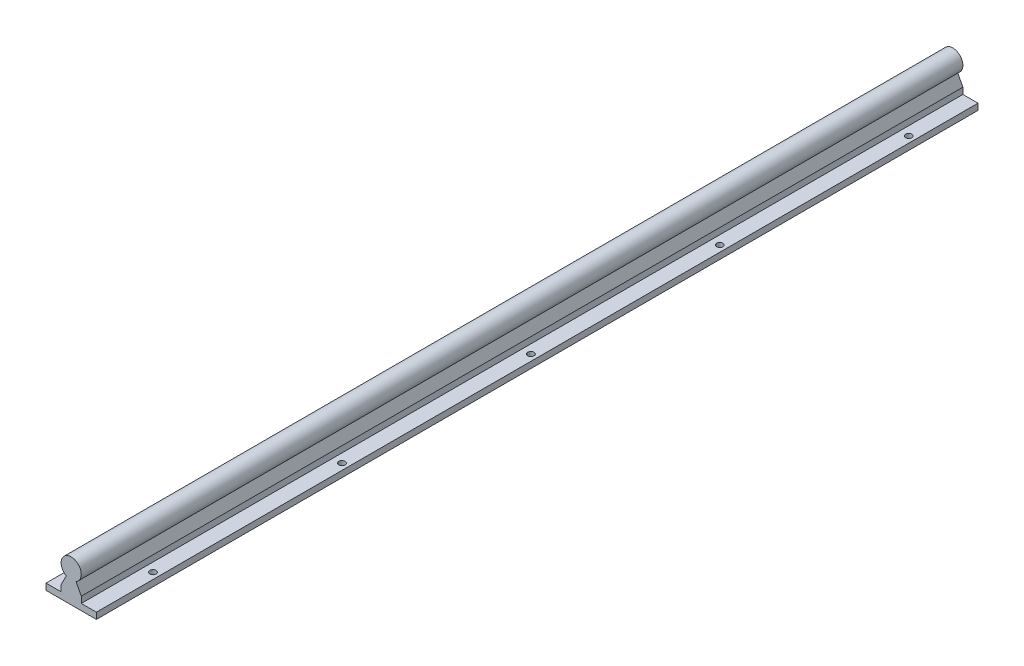
ISO-10303-21;
HEADER;
FILE_DESCRIPTION(('STEP AP214'),'2;1');
FILE_NAME('part.step','',(''),(''),'','','');
FILE_SCHEMA(('AUTOMOTIVE_DESIGN { 1 0 10303 214 1 1 1 1 }'));
ENDSEC;
DATA;
#1=APPLICATION_CONTEXT('core data for automotive mechanical design processes');
#2=APPLICATION_PROTOCOL_DEFINITION('international standard','automotive_design',2000,#1);
#3=PRODUCT_CONTEXT('',#1,'mechanical');
#4=PRODUCT('Part','Part','',(#3));
#5=PRODUCT_RELATED_PRODUCT_CATEGORY('part','',(#4));
#6=PRODUCT_DEFINITION_FORMATION('','',#4);
#7=PRODUCT_DEFINITION_CONTEXT('part definition',#1,'design');
#8=PRODUCT_DEFINITION('design','',#6,#7);
#9=PRODUCT_DEFINITION_SHAPE('','',#8);
#10=(LENGTH_UNIT() NAMED_UNIT(*) SI_UNIT(.MILLI.,.METRE.));
#11=(NAMED_UNIT(*) PLANE_ANGLE_UNIT() SI_UNIT($,.RADIAN.));
#12=(NAMED_UNIT(*) SI_UNIT($,.STERADIAN.) SOLID_ANGLE_UNIT());
#13=UNCERTAINTY_MEASURE_WITH_UNIT(LENGTH_MEASURE(1.E-05),#10,'distance_accuracy_value','');
#14=(GEOMETRIC_REPRESENTATION_CONTEXT(3) GLOBAL_UNCERTAINTY_ASSIGNED_CONTEXT((#13)) GLOBAL_UNIT_ASSIGNED_CONTEXT((#10,
#11,#12)) REPRESENTATION_CONTEXT('',''));
#15=CARTESIAN_POINT('',(0.,0.,0.));
#16=DIRECTION('',(0.,0.,1.));
#17=DIRECTION('',(1.,0.,0.));
#18=AXIS2_PLACEMENT_3D('',#15,#16,#17);
#19=CARTESIAN_POINT('',(-10.3929134539516,5.36146586323541,700.));
#20=DIRECTION('',(-0.88871189671419,0.458466099770382,0.));
#21=DIRECTION('',(-0.458466099770382,-0.888711896714191,0.));
#22=AXIS2_PLACEMENT_3D('',#19,#20,#21);
#23=PLANE('',#22);
#24=DIRECTION('',(0.458466099770382,0.888711896714191,0.));
#25=VECTOR('',#24,1.);
#26=CARTESIAN_POINT('',(-10.3929134539516,5.36146586323541,0.));
#27=LINE('',#26,#25);
#28=CARTESIAN_POINT('',(-8.,10.,0.));
#29=VERTEX_POINT('',#28);
#30=CARTESIAN_POINT('',(-3.87298334620742,18.,0.));
#31=VERTEX_POINT('',#30);
#32=EDGE_CURVE('E145',#29,#31,#27,.T.);
#33=ORIENTED_EDGE('',*,*,#32,.F.);
#34=DIRECTION('',(0.,0.,-1.));
#35=VECTOR('',#34,1.);
#36=CARTESIAN_POINT('',(-8.,10.,700.));
#37=LINE('',#36,#35);
#38=CARTESIAN_POINT('',(-8.,10.,700.));
#39=VERTEX_POINT('',#38);
#40=EDGE_CURVE('E42',#39,#29,#37,.T.);
#41=ORIENTED_EDGE('',*,*,#40,.F.);
#42=DIRECTION('',(0.458466099770382,0.888711896714191,0.));
#43=VECTOR('',#42,1.);
#44=CARTESIAN_POINT('',(-10.3929134539516,5.36146586323541,700.));
#45=LINE('',#44,#43);
#46=CARTESIAN_POINT('',(-3.87298334620742,18.,700.));
#47=VERTEX_POINT('',#46);
#48=EDGE_CURVE('E166',#39,#47,#45,.T.);
#49=ORIENTED_EDGE('',*,*,#48,.T.);
#50=DIRECTION('',(0.,0.,-1.));
#51=VECTOR('',#50,1.);
#52=CARTESIAN_POINT('',(-3.87298334620742,18.,700.));
#53=LINE('',#52,#51);
#54=EDGE_CURVE('E11',#47,#31,#53,.T.);
#55=ORIENTED_EDGE('',*,*,#54,.T.);
#56=EDGE_LOOP('',(#33,#41,#49,#55));
#57=FACE_BOUND('',#56,.T.);
#58=ADVANCED_FACE('F34',(#57),#23,.T.);
#59=CARTESIAN_POINT('',(-8.,0.,700.));
#60=DIRECTION('',(-1.,0.,0.));
#61=DIRECTION('',(0.,0.,1.));
#62=AXIS2_PLACEMENT_3D('',#59,#60,#61);
#63=PLANE('',#62);
#64=DIRECTION('',(0.,1.,0.));
#65=VECTOR('',#64,1.);
#66=CARTESIAN_POINT('',(-8.,0.,0.));
#67=LINE('',#66,#65);
#68=CARTESIAN_POINT('',(-8.,5.,0.));
#69=VERTEX_POINT('',#68);
#70=EDGE_CURVE('E147',#69,#29,#67,.T.);
#71=ORIENTED_EDGE('',*,*,#70,.F.);
#72=DIRECTION('',(0.,0.,-1.));
#73=VECTOR('',#72,1.);
#74=CARTESIAN_POINT('',(-8.,5.,700.));
#75=LINE('',#74,#73);
#76=CARTESIAN_POINT('',(-8.,5.,700.));
#77=VERTEX_POINT('',#76);
#78=EDGE_CURVE('E176',#77,#69,#75,.T.);
#79=ORIENTED_EDGE('',*,*,#78,.F.);
#80=DIRECTION('',(0.,1.,0.));
#81=VECTOR('',#80,1.);
#82=CARTESIAN_POINT('',(-8.,0.,700.));
#83=LINE('',#82,#81);
#84=EDGE_CURVE('E182',#77,#39,#83,.T.);
#85=ORIENTED_EDGE('',*,*,#84,.T.);
#86=ORIENTED_EDGE('',*,*,#40,.T.);
#87=EDGE_LOOP('',(#71,#79,#85,#86));
#88=FACE_BOUND('',#87,.T.);
#89=ADVANCED_FACE('F180',(#88),#63,.T.);
#90=CARTESIAN_POINT('',(0.,5.,700.));
#91=DIRECTION('',(0.,1.,0.));
#92=DIRECTION('',(0.,0.,1.));
#93=AXIS2_PLACEMENT_3D('',#90,#91,#92);
#94=PLANE('',#93);
#95=CARTESIAN_POINT('',(-15.,5.,49.9999999999999));
#96=DIRECTION('',(0.,1.,0.));
#97=DIRECTION('',(0.,0.,1.));
#98=AXIS2_PLACEMENT_3D('',#95,#96,#97);
#99=CIRCLE('',#98,2.49999999999999);
#100=CARTESIAN_POINT('',(-15.,5.,52.4999999999999));
#101=VERTEX_POINT('',#100);
#102=EDGE_CURVE('E269',#101,#101,#99,.T.);
#103=ORIENTED_EDGE('',*,*,#102,.F.);
#104=EDGE_LOOP('',(#103));
#105=FACE_BOUND('',#104,.T.);
#106=CARTESIAN_POINT('',(-15.,5.,200.));
#107=DIRECTION('',(0.,1.,0.));
#108=DIRECTION('',(0.,0.,1.));
#109=AXIS2_PLACEMENT_3D('',#106,#107,#108);
#110=CIRCLE('',#109,2.49999999999999);
#111=CARTESIAN_POINT('',(-15.,5.,202.5));
#112=VERTEX_POINT('',#111);
#113=EDGE_CURVE('E257',#112,#112,#110,.T.);
#114=ORIENTED_EDGE('',*,*,#113,.F.);
#115=EDGE_LOOP('',(#114));
#116=FACE_BOUND('',#115,.T.);
#117=CARTESIAN_POINT('',(-15.,5.,350.));
#118=DIRECTION('',(0.,1.,0.));
#119=DIRECTION('',(0.,0.,1.));
#120=AXIS2_PLACEMENT_3D('',#117,#118,#119);
#121=CIRCLE('',#120,2.49999999999999);
#122=CARTESIAN_POINT('',(-15.,5.,352.5));
#123=VERTEX_POINT('',#122);
#124=EDGE_CURVE('E245',#123,#123,#121,.T.);
#125=ORIENTED_EDGE('',*,*,#124,.F.);
#126=EDGE_LOOP('',(#125));
#127=FACE_BOUND('',#126,.T.);
#128=CARTESIAN_POINT('',(-15.,5.,500.));
#129=DIRECTION('',(0.,1.,0.));
#130=DIRECTION('',(0.,0.,1.));
#131=AXIS2_PLACEMENT_3D('',#128,#129,#130);
#132=CIRCLE('',#131,2.49999999999999);
#133=CARTESIAN_POINT('',(-15.,5.,502.5));
#134=VERTEX_POINT('',#133);
#135=EDGE_CURVE('E233',#134,#134,#132,.T.);
#136=ORIENTED_EDGE('',*,*,#135,.F.);
#137=EDGE_LOOP('',(#136));
#138=FACE_BOUND('',#137,.T.);
#139=CARTESIAN_POINT('',(-15.,5.,650.));
#140=DIRECTION('',(0.,1.,0.));
#141=DIRECTION('',(0.,0.,1.));
#142=AXIS2_PLACEMENT_3D('',#139,#140,#141);
#143=CIRCLE('',#142,2.49999999999999);
#144=CARTESIAN_POINT('',(-15.,5.,652.5));
#145=VERTEX_POINT('',#144);
#146=EDGE_CURVE('E219',#145,#145,#143,.T.);
#147=ORIENTED_EDGE('',*,*,#146,.F.);
#148=EDGE_LOOP('',(#147));
#149=FACE_BOUND('',#148,.T.);
#150=DIRECTION('',(1.,0.,0.));
#151=VECTOR('',#150,1.);
#152=CARTESIAN_POINT('',(0.,5.,0.));
#153=LINE('',#152,#151);
#154=CARTESIAN_POINT('',(-20.,5.,0.));
#155=VERTEX_POINT('',#154);
#156=EDGE_CURVE('E151',#155,#69,#153,.T.);
#157=ORIENTED_EDGE('',*,*,#156,.F.);
#158=DIRECTION('',(0.,0.,-1.));
#159=VECTOR('',#158,1.);
#160=CARTESIAN_POINT('',(-20.,5.,700.));
#161=LINE('',#160,#159);
#162=CARTESIAN_POINT('',(-20.,5.,700.));
#163=VERTEX_POINT('',#162);
#164=EDGE_CURVE('E174',#163,#155,#161,.T.);
#165=ORIENTED_EDGE('',*,*,#164,.F.);
#166=DIRECTION('',(1.,0.,0.));
#167=VECTOR('',#166,1.);
#168=CARTESIAN_POINT('',(0.,5.,700.));
#169=LINE('',#168,#167);
#170=EDGE_CURVE('E192',#163,#77,#169,.T.);
#171=ORIENTED_EDGE('',*,*,#170,.T.);
#172=ORIENTED_EDGE('',*,*,#78,.T.);
#173=EDGE_LOOP('',(#157,#165,#171,#172));
#174=FACE_BOUND('',#173,.T.);
#175=ADVANCED_FACE('F189',(#105,#116,#127,#138,#149,#174),#94,.T.);
#176=CARTESIAN_POINT('',(-20.,0.,700.));
#177=DIRECTION('',(-1.,0.,0.));
#178=DIRECTION('',(0.,0.,1.));
#179=AXIS2_PLACEMENT_3D('',#176,#177,#178);
#180=PLANE('',#179);
#181=DIRECTION('',(0.,1.,0.));
#182=VECTOR('',#181,1.);
#183=CARTESIAN_POINT('',(-20.,0.,0.));
#184=LINE('',#183,#182);
#185=CARTESIAN_POINT('',(-20.,0.,0.));
#186=VERTEX_POINT('',#185);
#187=EDGE_CURVE('E154',#186,#155,#184,.T.);
#188=ORIENTED_EDGE('',*,*,#187,.F.);
#189=DIRECTION('',(0.,0.,-1.));
#190=VECTOR('',#189,1.);
#191=CARTESIAN_POINT('',(-20.,0.,700.));
#192=LINE('',#191,#190);
#193=CARTESIAN_POINT('',(-20.,0.,700.));
#194=VERTEX_POINT('',#193);
#195=EDGE_CURVE('E172',#194,#186,#192,.T.);
#196=ORIENTED_EDGE('',*,*,#195,.F.);
#197=DIRECTION('',(0.,1.,0.));
#198=VECTOR('',#197,1.);
#199=CARTESIAN_POINT('',(-20.,0.,700.));
#200=LINE('',#199,#198);
#201=EDGE_CURVE('E196',#194,#163,#200,.T.);
#202=ORIENTED_EDGE('',*,*,#201,.T.);
#203=ORIENTED_EDGE('',*,*,#164,.T.);
#204=EDGE_LOOP('',(#188,#196,#202,#203));
#205=FACE_BOUND('',#204,.T.);
#206=ADVANCED_FACE('F202',(#205),#180,.T.);
#207=CARTESIAN_POINT('',(0.,0.,700.));
#208=DIRECTION('',(0.,1.,0.));
#209=DIRECTION('',(0.,0.,1.));
#210=AXIS2_PLACEMENT_3D('',#207,#208,#209);
#211=PLANE('',#210);
#212=CARTESIAN_POINT('',(15.,0.,49.9999999999999));
#213=DIRECTION('',(0.,1.,0.));
#214=DIRECTION('',(0.,0.,1.));
#215=AXIS2_PLACEMENT_3D('',#212,#213,#214);
#216=CIRCLE('',#215,2.49999999999999);
#217=CARTESIAN_POINT('',(15.,0.,52.4999999999999));
#218=VERTEX_POINT('',#217);
#219=EDGE_CURVE('E272',#218,#218,#216,.T.);
#220=ORIENTED_EDGE('',*,*,#219,.T.);
#221=EDGE_LOOP('',(#220));
#222=FACE_BOUND('',#221,.T.);
#223=CARTESIAN_POINT('',(-15.,0.,49.9999999999999));
#224=DIRECTION('',(0.,1.,0.));
#225=DIRECTION('',(0.,0.,1.));
#226=AXIS2_PLACEMENT_3D('',#223,#224,#225);
#227=CIRCLE('',#226,2.49999999999999);
#228=CARTESIAN_POINT('',(-15.,0.,52.4999999999999));
#229=VERTEX_POINT('',#228);
#230=EDGE_CURVE('E266',#229,#229,#227,.T.);
#231=ORIENTED_EDGE('',*,*,#230,.T.);
#232=EDGE_LOOP('',(#231));
#233=FACE_BOUND('',#232,.T.);
#234=CARTESIAN_POINT('',(15.,0.,200.));
#235=DIRECTION('',(0.,1.,0.));
#236=DIRECTION('',(0.,0.,1.));
#237=AXIS2_PLACEMENT_3D('',#234,#235,#236);
#238=CIRCLE('',#237,2.49999999999999);
#239=CARTESIAN_POINT('',(15.,0.,202.5));
#240=VERTEX_POINT('',#239);
#241=EDGE_CURVE('E260',#240,#240,#238,.T.);
#242=ORIENTED_EDGE('',*,*,#241,.T.);
#243=EDGE_LOOP('',(#242));
#244=FACE_BOUND('',#243,.T.);
#245=CARTESIAN_POINT('',(-15.,0.,200.));
#246=DIRECTION('',(0.,1.,0.));
#247=DIRECTION('',(0.,0.,1.));
#248=AXIS2_PLACEMENT_3D('',#245,#246,#247);
#249=CIRCLE('',#248,2.49999999999999);
#250=CARTESIAN_POINT('',(-15.,0.,202.5));
#251=VERTEX_POINT('',#250);
#252=EDGE_CURVE('E254',#251,#251,#249,.T.);
#253=ORIENTED_EDGE('',*,*,#252,.T.);
#254=EDGE_LOOP('',(#253));
#255=FACE_BOUND('',#254,.T.);
#256=CARTESIAN_POINT('',(15.,0.,350.));
#257=DIRECTION('',(0.,1.,0.));
#258=DIRECTION('',(0.,0.,1.));
#259=AXIS2_PLACEMENT_3D('',#256,#257,#258);
#260=CIRCLE('',#259,2.49999999999999);
#261=CARTESIAN_POINT('',(15.,0.,352.5));
#262=VERTEX_POINT('',#261);
#263=EDGE_CURVE('E248',#262,#262,#260,.T.);
#264=ORIENTED_EDGE('',*,*,#263,.T.);
#265=EDGE_LOOP('',(#264));
#266=FACE_BOUND('',#265,.T.);
#267=CARTESIAN_POINT('',(-15.,0.,350.));
#268=DIRECTION('',(0.,1.,0.));
#269=DIRECTION('',(0.,0.,1.));
#270=AXIS2_PLACEMENT_3D('',#267,#268,#269);
#271=CIRCLE('',#270,2.49999999999999);
#272=CARTESIAN_POINT('',(-15.,0.,352.5));
#273=VERTEX_POINT('',#272);
#274=EDGE_CURVE('E242',#273,#273,#271,.T.);
#275=ORIENTED_EDGE('',*,*,#274,.T.);
#276=EDGE_LOOP('',(#275));
#277=FACE_BOUND('',#276,.T.);
#278=CARTESIAN_POINT('',(15.,0.,500.));
#279=DIRECTION('',(0.,1.,0.));
#280=DIRECTION('',(0.,0.,1.));
#281=AXIS2_PLACEMENT_3D('',#278,#279,#280);
#282=CIRCLE('',#281,2.49999999999999);
#283=CARTESIAN_POINT('',(15.,0.,502.5));
#284=VERTEX_POINT('',#283);
#285=EDGE_CURVE('E236',#284,#284,#282,.T.);
#286=ORIENTED_EDGE('',*,*,#285,.T.);
#287=EDGE_LOOP('',(#286));
#288=FACE_BOUND('',#287,.T.);
#289=CARTESIAN_POINT('',(-15.,0.,500.));
#290=DIRECTION('',(0.,1.,0.));
#291=DIRECTION('',(0.,0.,1.));
#292=AXIS2_PLACEMENT_3D('',#289,#290,#291);
#293=CIRCLE('',#292,2.49999999999999);
#294=CARTESIAN_POINT('',(-15.,0.,502.5));
#295=VERTEX_POINT('',#294);
#296=EDGE_CURVE('E230',#295,#295,#293,.T.);
#297=ORIENTED_EDGE('',*,*,#296,.T.);
#298=EDGE_LOOP('',(#297));
#299=FACE_BOUND('',#298,.T.);
#300=CARTESIAN_POINT('',(15.,0.,650.));
#301=DIRECTION('',(0.,1.,0.));
#302=DIRECTION('',(0.,0.,1.));
#303=AXIS2_PLACEMENT_3D('',#300,#301,#302);
#304=CIRCLE('',#303,2.49999999999999);
#305=CARTESIAN_POINT('',(15.,0.,652.5));
#306=VERTEX_POINT('',#305);
#307=EDGE_CURVE('E224',#306,#306,#304,.T.);
#308=ORIENTED_EDGE('',*,*,#307,.T.);
#309=EDGE_LOOP('',(#308));
#310=FACE_BOUND('',#309,.T.);
#311=CARTESIAN_POINT('',(-15.,0.,650.));
#312=DIRECTION('',(0.,1.,0.));
#313=DIRECTION('',(0.,0.,1.));
#314=AXIS2_PLACEMENT_3D('',#311,#312,#313);
#315=CIRCLE('',#314,2.49999999999999);
#316=CARTESIAN_POINT('',(-15.,0.,652.5));
#317=VERTEX_POINT('',#316);
#318=EDGE_CURVE('E216',#317,#317,#315,.T.);
#319=ORIENTED_EDGE('',*,*,#318,.T.);
#320=EDGE_LOOP('',(#319));
#321=FACE_BOUND('',#320,.T.);
#322=DIRECTION('',(1.,0.,0.));
#323=VECTOR('',#322,1.);
#324=CARTESIAN_POINT('',(0.,0.,0.));
#325=LINE('',#324,#323);
#326=CARTESIAN_POINT('',(20.,0.,0.));
#327=VERTEX_POINT('',#326);
#328=EDGE_CURVE('E157',#186,#327,#325,.T.);
#329=ORIENTED_EDGE('',*,*,#328,.T.);
#330=DIRECTION('',(0.,0.,-1.));
#331=VECTOR('',#330,1.);
#332=CARTESIAN_POINT('',(20.,0.,700.));
#333=LINE('',#332,#331);
#334=CARTESIAN_POINT('',(20.,0.,700.));
#335=VERTEX_POINT('',#334);
#336=EDGE_CURVE('E134',#335,#327,#333,.T.);
#337=ORIENTED_EDGE('',*,*,#336,.F.);
#338=DIRECTION('',(1.,0.,0.));
#339=VECTOR('',#338,1.);
#340=CARTESIAN_POINT('',(0.,0.,700.));
#341=LINE('',#340,#339);
#342=EDGE_CURVE('E122',#194,#335,#341,.T.);
#343=ORIENTED_EDGE('',*,*,#342,.F.);
#344=ORIENTED_EDGE('',*,*,#195,.T.);
#345=EDGE_LOOP('',(#329,#337,#343,#344));
#346=FACE_BOUND('',#345,.T.);
#347=ADVANCED_FACE('F204',(#222,#233,#244,#255,#266,#277,#288,#299,#310,#321,#346),#211,.F.);
#348=CARTESIAN_POINT('',(20.,0.,700.));
#349=DIRECTION('',(-1.,0.,0.));
#350=DIRECTION('',(0.,0.,1.));
#351=AXIS2_PLACEMENT_3D('',#348,#349,#350);
#352=PLANE('',#351);
#353=DIRECTION('',(0.,1.,0.));
#354=VECTOR('',#353,1.);
#355=CARTESIAN_POINT('',(20.,0.,0.));
#356=LINE('',#355,#354);
#357=CARTESIAN_POINT('',(20.,5.,0.));
#358=VERTEX_POINT('',#357);
#359=EDGE_CURVE('E131',#327,#358,#356,.T.);
#360=ORIENTED_EDGE('',*,*,#359,.T.);
#361=DIRECTION('',(0.,0.,-1.));
#362=VECTOR('',#361,1.);
#363=CARTESIAN_POINT('',(20.,5.,700.));
#364=LINE('',#363,#362);
#365=CARTESIAN_POINT('',(20.,5.,700.));
#366=VERTEX_POINT('',#365);
#367=EDGE_CURVE('E128',#366,#358,#364,.T.);
#368=ORIENTED_EDGE('',*,*,#367,.F.);
#369=DIRECTION('',(0.,1.,0.));
#370=VECTOR('',#369,1.);
#371=CARTESIAN_POINT('',(20.,0.,700.));
#372=LINE('',#371,#370);
#373=EDGE_CURVE('E114',#335,#366,#372,.T.);
#374=ORIENTED_EDGE('',*,*,#373,.F.);
#375=ORIENTED_EDGE('',*,*,#336,.T.);
#376=EDGE_LOOP('',(#360,#368,#374,#375));
#377=FACE_BOUND('',#376,.T.);
#378=ADVANCED_FACE('F129',(#377),#352,.F.);
#379=CARTESIAN_POINT('',(0.,5.,700.));
#380=DIRECTION('',(0.,-1.,0.));
#381=DIRECTION('',(0.,0.,-1.));
#382=AXIS2_PLACEMENT_3D('',#379,#380,#381);
#383=PLANE('',#382);
#384=CARTESIAN_POINT('',(15.,5.,49.9999999999999));
#385=DIRECTION('',(0.,1.,0.));
#386=DIRECTION('',(0.,0.,1.));
#387=AXIS2_PLACEMENT_3D('',#384,#385,#386);
#388=CIRCLE('',#387,2.49999999999999);
#389=CARTESIAN_POINT('',(15.,5.,52.4999999999999));
#390=VERTEX_POINT('',#389);
#391=EDGE_CURVE('E275',#390,#390,#388,.T.);
#392=ORIENTED_EDGE('',*,*,#391,.F.);
#393=EDGE_LOOP('',(#392));
#394=FACE_BOUND('',#393,.T.);
#395=CARTESIAN_POINT('',(15.,5.,200.));
#396=DIRECTION('',(0.,1.,0.));
#397=DIRECTION('',(0.,0.,1.));
#398=AXIS2_PLACEMENT_3D('',#395,#396,#397);
#399=CIRCLE('',#398,2.49999999999999);
#400=CARTESIAN_POINT('',(15.,5.,202.5));
#401=VERTEX_POINT('',#400);
#402=EDGE_CURVE('E263',#401,#401,#399,.T.);
#403=ORIENTED_EDGE('',*,*,#402,.F.);
#404=EDGE_LOOP('',(#403));
#405=FACE_BOUND('',#404,.T.);
#406=CARTESIAN_POINT('',(15.,5.,350.));
#407=DIRECTION('',(0.,1.,0.));
#408=DIRECTION('',(0.,0.,1.));
#409=AXIS2_PLACEMENT_3D('',#406,#407,#408);
#410=CIRCLE('',#409,2.49999999999999);
#411=CARTESIAN_POINT('',(15.,5.,352.5));
#412=VERTEX_POINT('',#411);
#413=EDGE_CURVE('E251',#412,#412,#410,.T.);
#414=ORIENTED_EDGE('',*,*,#413,.F.);
#415=EDGE_LOOP('',(#414));
#416=FACE_BOUND('',#415,.T.);
#417=CARTESIAN_POINT('',(15.,5.,500.));
#418=DIRECTION('',(0.,1.,0.));
#419=DIRECTION('',(0.,0.,1.));
#420=AXIS2_PLACEMENT_3D('',#417,#418,#419);
#421=CIRCLE('',#420,2.49999999999999);
#422=CARTESIAN_POINT('',(15.,5.,502.5));
#423=VERTEX_POINT('',#422);
#424=EDGE_CURVE('E239',#423,#423,#421,.T.);
#425=ORIENTED_EDGE('',*,*,#424,.F.);
#426=EDGE_LOOP('',(#425));
#427=FACE_BOUND('',#426,.T.);
#428=CARTESIAN_POINT('',(15.,5.,650.));
#429=DIRECTION('',(0.,1.,0.));
#430=DIRECTION('',(0.,0.,1.));
#431=AXIS2_PLACEMENT_3D('',#428,#429,#430);
#432=CIRCLE('',#431,2.49999999999999);
#433=CARTESIAN_POINT('',(15.,5.,652.5));
#434=VERTEX_POINT('',#433);
#435=EDGE_CURVE('E227',#434,#434,#432,.T.);
#436=ORIENTED_EDGE('',*,*,#435,.F.);
#437=EDGE_LOOP('',(#436));
#438=FACE_BOUND('',#437,.T.);
#439=DIRECTION('',(-1.,0.,0.));
#440=VECTOR('',#439,1.);
#441=CARTESIAN_POINT('',(0.,5.,0.));
#442=LINE('',#441,#440);
#443=CARTESIAN_POINT('',(8.,5.,0.));
#444=VERTEX_POINT('',#443);
#445=EDGE_CURVE('E160',#358,#444,#442,.T.);
#446=ORIENTED_EDGE('',*,*,#445,.T.);
#447=DIRECTION('',(0.,0.,-1.));
#448=VECTOR('',#447,1.);
#449=CARTESIAN_POINT('',(8.,5.,700.));
#450=LINE('',#449,#448);
#451=CARTESIAN_POINT('',(8.,5.,700.));
#452=VERTEX_POINT('',#451);
#453=EDGE_CURVE('E135',#452,#444,#450,.T.);
#454=ORIENTED_EDGE('',*,*,#453,.F.);
#455=DIRECTION('',(-1.,0.,0.));
#456=VECTOR('',#455,1.);
#457=CARTESIAN_POINT('',(0.,5.,700.));
#458=LINE('',#457,#456);
#459=EDGE_CURVE('E118',#366,#452,#458,.T.);
#460=ORIENTED_EDGE('',*,*,#459,.F.);
#461=ORIENTED_EDGE('',*,*,#367,.T.);
#462=EDGE_LOOP('',(#446,#454,#460,#461));
#463=FACE_BOUND('',#462,.T.);
#464=ADVANCED_FACE('F137',(#394,#405,#416,#427,#438,#463),#383,.F.);
#465=CARTESIAN_POINT('',(8.,0.,700.));
#466=DIRECTION('',(-1.,0.,0.));
#467=DIRECTION('',(0.,0.,1.));
#468=AXIS2_PLACEMENT_3D('',#465,#466,#467);
#469=PLANE('',#468);
#470=DIRECTION('',(0.,1.,0.));
#471=VECTOR('',#470,1.);
#472=CARTESIAN_POINT('',(8.,0.,0.));
#473=LINE('',#472,#471);
#474=CARTESIAN_POINT('',(8.,10.,0.));
#475=VERTEX_POINT('',#474);
#476=EDGE_CURVE('E82',#444,#475,#473,.T.);
#477=ORIENTED_EDGE('',*,*,#476,.T.);
#478=DIRECTION('',(0.,0.,-1.));
#479=VECTOR('',#478,1.);
#480=CARTESIAN_POINT('',(8.,10.,700.));
#481=LINE('',#480,#479);
#482=CARTESIAN_POINT('',(8.,10.,700.));
#483=VERTEX_POINT('',#482);
#484=EDGE_CURVE('E168',#483,#475,#481,.T.);
#485=ORIENTED_EDGE('',*,*,#484,.F.);
#486=DIRECTION('',(0.,1.,0.));
#487=VECTOR('',#486,1.);
#488=CARTESIAN_POINT('',(8.,0.,700.));
#489=LINE('',#488,#487);
#490=EDGE_CURVE('E50',#452,#483,#489,.T.);
#491=ORIENTED_EDGE('',*,*,#490,.F.);
#492=ORIENTED_EDGE('',*,*,#453,.T.);
#493=EDGE_LOOP('',(#477,#485,#491,#492));
#494=FACE_BOUND('',#493,.T.);
#495=ADVANCED_FACE('F205',(#494),#469,.F.);
#496=CARTESIAN_POINT('',(10.3929134539516,5.36146586323541,700.));
#497=DIRECTION('',(-0.88871189671419,-0.458466099770382,0.));
#498=DIRECTION('',(0.458466099770382,-0.888711896714191,0.));
#499=AXIS2_PLACEMENT_3D('',#496,#497,#498);
#500=PLANE('',#499);
#501=DIRECTION('',(-0.458466099770382,0.888711896714191,0.));
#502=VECTOR('',#501,1.);
#503=CARTESIAN_POINT('',(10.3929134539516,5.36146586323541,0.));
#504=LINE('',#503,#502);
#505=CARTESIAN_POINT('',(3.87298334620742,18.,0.));
#506=VERTEX_POINT('',#505);
#507=EDGE_CURVE('E163',#475,#506,#504,.T.);
#508=ORIENTED_EDGE('',*,*,#507,.T.);
#509=DIRECTION('',(0.,0.,-1.));
#510=VECTOR('',#509,1.);
#511=CARTESIAN_POINT('',(3.87298334620742,18.,700.));
#512=LINE('',#511,#510);
#513=CARTESIAN_POINT('',(3.87298334620742,18.,700.));
#514=VERTEX_POINT('',#513);
#515=EDGE_CURVE('E144',#514,#506,#512,.T.);
#516=ORIENTED_EDGE('',*,*,#515,.F.);
#517=DIRECTION('',(-0.458466099770382,0.888711896714191,0.));
#518=VECTOR('',#517,1.);
#519=CARTESIAN_POINT('',(10.3929134539516,5.36146586323541,700.));
#520=LINE('',#519,#518);
#521=EDGE_CURVE('E139',#483,#514,#520,.T.);
#522=ORIENTED_EDGE('',*,*,#521,.F.);
#523=ORIENTED_EDGE('',*,*,#484,.T.);
#524=EDGE_LOOP('',(#508,#516,#522,#523));
#525=FACE_BOUND('',#524,.T.);
#526=ADVANCED_FACE('F209',(#525),#500,.F.);
#527=CARTESIAN_POINT('',(0.,0.,700.));
#528=DIRECTION('',(0.,0.,1.));
#529=DIRECTION('',(1.,0.,0.));
#530=AXIS2_PLACEMENT_3D('',#527,#528,#529);
#531=PLANE('',#530);
#532=ORIENTED_EDGE('',*,*,#521,.T.);
#533=CARTESIAN_POINT('',(0.,25.,700.));
#534=DIRECTION('',(0.,0.,1.));
#535=DIRECTION('',(1.,0.,0.));
#536=AXIS2_PLACEMENT_3D('',#533,#534,#535);
#537=CIRCLE('',#536,8.);
#538=EDGE_CURVE('E148',#514,#47,#537,.T.);
#539=ORIENTED_EDGE('',*,*,#538,.T.);
#540=ORIENTED_EDGE('',*,*,#48,.F.);
#541=ORIENTED_EDGE('',*,*,#84,.F.);
#542=ORIENTED_EDGE('',*,*,#170,.F.);
#543=ORIENTED_EDGE('',*,*,#201,.F.);
#544=ORIENTED_EDGE('',*,*,#342,.T.);
#545=ORIENTED_EDGE('',*,*,#373,.T.);
#546=ORIENTED_EDGE('',*,*,#459,.T.);
#547=ORIENTED_EDGE('',*,*,#490,.T.);
#548=EDGE_LOOP('',(#532,#539,#540,#541,#542,#543,#544,#545,#546,#547));
#549=FACE_BOUND('',#548,.T.);
#550=ADVANCED_FACE('F116',(#549),#531,.T.);
#551=CARTESIAN_POINT('',(0.,0.,0.));
#552=DIRECTION('',(0.,0.,1.));
#553=DIRECTION('',(1.,0.,0.));
#554=AXIS2_PLACEMENT_3D('',#551,#552,#553);
#555=PLANE('',#554);
#556=ORIENTED_EDGE('',*,*,#32,.T.);
#557=CARTESIAN_POINT('',(0.,25.,0.));
#558=DIRECTION('',(0.,0.,1.));
#559=DIRECTION('',(1.,0.,0.));
#560=AXIS2_PLACEMENT_3D('',#557,#558,#559);
#561=CIRCLE('',#560,8.);
#562=EDGE_CURVE('E90',#506,#31,#561,.T.);
#563=ORIENTED_EDGE('',*,*,#562,.F.);
#564=ORIENTED_EDGE('',*,*,#507,.F.);
#565=ORIENTED_EDGE('',*,*,#476,.F.);
#566=ORIENTED_EDGE('',*,*,#445,.F.);
#567=ORIENTED_EDGE('',*,*,#359,.F.);
#568=ORIENTED_EDGE('',*,*,#328,.F.);
#569=ORIENTED_EDGE('',*,*,#187,.T.);
#570=ORIENTED_EDGE('',*,*,#156,.T.);
#571=ORIENTED_EDGE('',*,*,#70,.T.);
#572=EDGE_LOOP('',(#556,#563,#564,#565,#566,#567,#568,#569,#570,#571));
#573=FACE_BOUND('',#572,.T.);
#574=ADVANCED_FACE('F184',(#573),#555,.F.);
#575=CARTESIAN_POINT('',(0.,25.,700.));
#576=DIRECTION('',(0.,0.,-1.));
#577=DIRECTION('',(-1.,0.,0.));
#578=AXIS2_PLACEMENT_3D('',#575,#576,#577);
#579=CYLINDRICAL_SURFACE('',#578,8.);
#580=ORIENTED_EDGE('',*,*,#54,.F.);
#581=ORIENTED_EDGE('',*,*,#538,.F.);
#582=ORIENTED_EDGE('',*,*,#515,.T.);
#583=ORIENTED_EDGE('',*,*,#562,.T.);
#584=EDGE_LOOP('',(#580,#581,#582,#583));
#585=FACE_BOUND('',#584,.T.);
#586=ADVANCED_FACE('F215',(#585),#579,.T.);
#587=CARTESIAN_POINT('',(-15.,5.,650.));
#588=DIRECTION('',(0.,1.,0.));
#589=DIRECTION('',(0.,0.,1.));
#590=AXIS2_PLACEMENT_3D('',#587,#588,#589);
#591=CYLINDRICAL_SURFACE('',#590,2.49999999999999);
#592=ORIENTED_EDGE('',*,*,#318,.F.);
#593=EDGE_LOOP('',(#592));
#594=FACE_BOUND('',#593,.T.);
#595=ORIENTED_EDGE('',*,*,#146,.T.);
#596=EDGE_LOOP('',(#595));
#597=FACE_BOUND('',#596,.T.);
#598=ADVANCED_FACE('F295',(#594,#597),#591,.F.);
#599=CARTESIAN_POINT('',(15.,5.,650.));
#600=DIRECTION('',(0.,1.,0.));
#601=DIRECTION('',(0.,0.,1.));
#602=AXIS2_PLACEMENT_3D('',#599,#600,#601);
#603=CYLINDRICAL_SURFACE('',#602,2.49999999999999);
#604=ORIENTED_EDGE('',*,*,#307,.F.);
#605=EDGE_LOOP('',(#604));
#606=FACE_BOUND('',#605,.T.);
#607=ORIENTED_EDGE('',*,*,#435,.T.);
#608=EDGE_LOOP('',(#607));
#609=FACE_BOUND('',#608,.T.);
#610=ADVANCED_FACE('F292',(#606,#609),#603,.F.);
#611=CARTESIAN_POINT('',(-15.,5.,500.));
#612=DIRECTION('',(0.,1.,0.));
#613=DIRECTION('',(0.,0.,1.));
#614=AXIS2_PLACEMENT_3D('',#611,#612,#613);
#615=CYLINDRICAL_SURFACE('',#614,2.49999999999999);
#616=ORIENTED_EDGE('',*,*,#296,.F.);
#617=EDGE_LOOP('',(#616));
#618=FACE_BOUND('',#617,.T.);
#619=ORIENTED_EDGE('',*,*,#135,.T.);
#620=EDGE_LOOP('',(#619));
#621=FACE_BOUND('',#620,.T.);
#622=ADVANCED_FACE('F294',(#618,#621),#615,.F.);
#623=CARTESIAN_POINT('',(15.,5.,500.));
#624=DIRECTION('',(0.,1.,0.));
#625=DIRECTION('',(0.,0.,1.));
#626=AXIS2_PLACEMENT_3D('',#623,#624,#625);
#627=CYLINDRICAL_SURFACE('',#626,2.49999999999999);
#628=ORIENTED_EDGE('',*,*,#285,.F.);
#629=EDGE_LOOP('',(#628));
#630=FACE_BOUND('',#629,.T.);
#631=ORIENTED_EDGE('',*,*,#424,.T.);
#632=EDGE_LOOP('',(#631));
#633=FACE_BOUND('',#632,.T.);
#634=ADVANCED_FACE('F302',(#630,#633),#627,.F.);
#635=CARTESIAN_POINT('',(-15.,5.,350.));
#636=DIRECTION('',(0.,1.,0.));
#637=DIRECTION('',(0.,0.,1.));
#638=AXIS2_PLACEMENT_3D('',#635,#636,#637);
#639=CYLINDRICAL_SURFACE('',#638,2.49999999999999);
#640=ORIENTED_EDGE('',*,*,#274,.F.);
#641=EDGE_LOOP('',(#640));
#642=FACE_BOUND('',#641,.T.);
#643=ORIENTED_EDGE('',*,*,#124,.T.);
#644=EDGE_LOOP('',(#643));
#645=FACE_BOUND('',#644,.T.);
#646=ADVANCED_FACE('F373',(#642,#645),#639,.F.);
#647=CARTESIAN_POINT('',(15.,5.,350.));
#648=DIRECTION('',(0.,1.,0.));
#649=DIRECTION('',(0.,0.,1.));
#650=AXIS2_PLACEMENT_3D('',#647,#648,#649);
#651=CYLINDRICAL_SURFACE('',#650,2.49999999999999);
#652=ORIENTED_EDGE('',*,*,#263,.F.);
#653=EDGE_LOOP('',(#652));
#654=FACE_BOUND('',#653,.T.);
#655=ORIENTED_EDGE('',*,*,#413,.T.);
#656=EDGE_LOOP('',(#655));
#657=FACE_BOUND('',#656,.T.);
#658=ADVANCED_FACE('F383',(#654,#657),#651,.F.);
#659=CARTESIAN_POINT('',(-15.,5.,200.));
#660=DIRECTION('',(0.,1.,0.));
#661=DIRECTION('',(0.,0.,1.));
#662=AXIS2_PLACEMENT_3D('',#659,#660,#661);
#663=CYLINDRICAL_SURFACE('',#662,2.49999999999999);
#664=ORIENTED_EDGE('',*,*,#252,.F.);
#665=EDGE_LOOP('',(#664));
#666=FACE_BOUND('',#665,.T.);
#667=ORIENTED_EDGE('',*,*,#113,.T.);
#668=EDGE_LOOP('',(#667));
#669=FACE_BOUND('',#668,.T.);
#670=ADVANCED_FACE('F393',(#666,#669),#663,.F.);
#671=CARTESIAN_POINT('',(15.,5.,200.));
#672=DIRECTION('',(0.,1.,0.));
#673=DIRECTION('',(0.,0.,1.));
#674=AXIS2_PLACEMENT_3D('',#671,#672,#673);
#675=CYLINDRICAL_SURFACE('',#674,2.49999999999999);
#676=ORIENTED_EDGE('',*,*,#241,.F.);
#677=EDGE_LOOP('',(#676));
#678=FACE_BOUND('',#677,.T.);
#679=ORIENTED_EDGE('',*,*,#402,.T.);
#680=EDGE_LOOP('',(#679));
#681=FACE_BOUND('',#680,.T.);
#682=ADVANCED_FACE('F403',(#678,#681),#675,.F.);
#683=CARTESIAN_POINT('',(-15.,5.,49.9999999999999));
#684=DIRECTION('',(0.,1.,0.));
#685=DIRECTION('',(0.,0.,1.));
#686=AXIS2_PLACEMENT_3D('',#683,#684,#685);
#687=CYLINDRICAL_SURFACE('',#686,2.49999999999999);
#688=ORIENTED_EDGE('',*,*,#230,.F.);
#689=EDGE_LOOP('',(#688));
#690=FACE_BOUND('',#689,.T.);
#691=ORIENTED_EDGE('',*,*,#102,.T.);
#692=EDGE_LOOP('',(#691));
#693=FACE_BOUND('',#692,.T.);
#694=ADVANCED_FACE('F413',(#690,#693),#687,.F.);
#695=CARTESIAN_POINT('',(15.,5.,49.9999999999999));
#696=DIRECTION('',(0.,1.,0.));
#697=DIRECTION('',(0.,0.,1.));
#698=AXIS2_PLACEMENT_3D('',#695,#696,#697);
#699=CYLINDRICAL_SURFACE('',#698,2.49999999999999);
#700=ORIENTED_EDGE('',*,*,#219,.F.);
#701=EDGE_LOOP('',(#700));
#702=FACE_BOUND('',#701,.T.);
#703=ORIENTED_EDGE('',*,*,#391,.T.);
#704=EDGE_LOOP('',(#703));
#705=FACE_BOUND('',#704,.T.);
#706=ADVANCED_FACE('F279',(#702,#705),#699,.F.);
#707=CLOSED_SHELL('',(#58,#89,#175,#206,#347,#378,#464,#495,#526,#550,#574,#586,#598,#610,#622,
#634,#646,#658,#670,#682,#694,#706));
#708=MANIFOLD_SOLID_BREP('B2',#707);
#709=ADVANCED_BREP_SHAPE_REPRESENTATION('',(#18,#708),#14);
#710=SHAPE_DEFINITION_REPRESENTATION(#9,#709);
ENDSEC;
END-ISO-10303-21;
